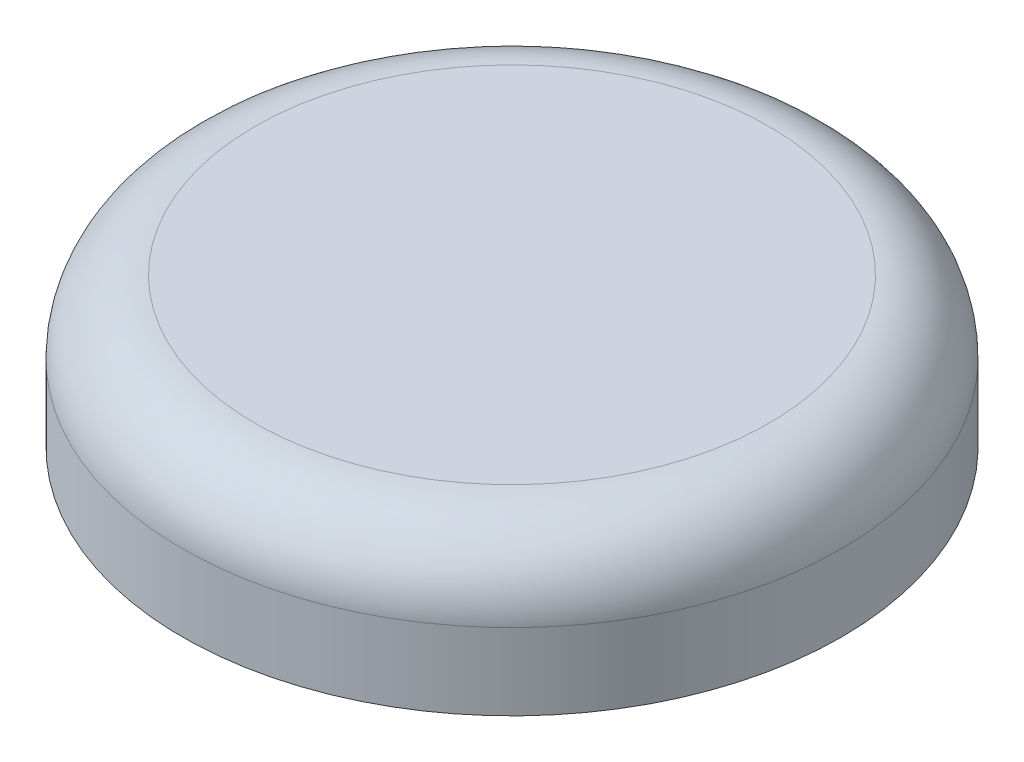
ISO-10303-21;
HEADER;
FILE_DESCRIPTION(('STEP AP214'),'2;1');
FILE_NAME('part.step','',(''),(''),'','','');
FILE_SCHEMA(('AUTOMOTIVE_DESIGN { 1 0 10303 214 1 1 1 1 }'));
ENDSEC;
DATA;
#1=APPLICATION_CONTEXT('core data for automotive mechanical design processes');
#2=APPLICATION_PROTOCOL_DEFINITION('international standard','automotive_design',2000,#1);
#3=PRODUCT_CONTEXT('',#1,'mechanical');
#4=PRODUCT('Part','Part','',(#3));
#5=PRODUCT_RELATED_PRODUCT_CATEGORY('part','',(#4));
#6=PRODUCT_DEFINITION_FORMATION('','',#4);
#7=PRODUCT_DEFINITION_CONTEXT('part definition',#1,'design');
#8=PRODUCT_DEFINITION('design','',#6,#7);
#9=PRODUCT_DEFINITION_SHAPE('','',#8);
#10=(LENGTH_UNIT() NAMED_UNIT(*) SI_UNIT(.MILLI.,.METRE.));
#11=(NAMED_UNIT(*) PLANE_ANGLE_UNIT() SI_UNIT($,.RADIAN.));
#12=(NAMED_UNIT(*) SI_UNIT($,.STERADIAN.) SOLID_ANGLE_UNIT());
#13=UNCERTAINTY_MEASURE_WITH_UNIT(LENGTH_MEASURE(1.E-05),#10,'distance_accuracy_value','');
#14=(GEOMETRIC_REPRESENTATION_CONTEXT(3) GLOBAL_UNCERTAINTY_ASSIGNED_CONTEXT((#13)) GLOBAL_UNIT_ASSIGNED_CONTEXT((#10,
#11,#12)) REPRESENTATION_CONTEXT('',''));
#15=CARTESIAN_POINT('',(0.,0.,0.));
#16=DIRECTION('',(0.,0.,1.));
#17=DIRECTION('',(1.,0.,0.));
#18=AXIS2_PLACEMENT_3D('',#15,#16,#17);
#19=CARTESIAN_POINT('',(-19.5,0.,0.));
#20=DIRECTION('',(0.,-1.,0.));
#21=DIRECTION('',(1.,0.,0.));
#22=AXIS2_PLACEMENT_3D('',#19,#20,#21);
#23=PLANE('',#22);
#24=CARTESIAN_POINT('',(0.,0.,0.));
#25=DIRECTION('',(0.,1.,0.));
#26=DIRECTION('',(-1.,0.,0.));
#27=AXIS2_PLACEMENT_3D('',#24,#25,#26);
#28=CIRCLE('',#27,19.5);
#29=CARTESIAN_POINT('',(-19.5,0.,0.));
#30=VERTEX_POINT('',#29);
#31=EDGE_CURVE('E59',#30,#30,#28,.T.);
#32=ORIENTED_EDGE('',*,*,#31,.F.);
#33=EDGE_LOOP('',(#32));
#34=FACE_BOUND('',#33,.T.);
#35=ADVANCED_FACE('F31',(#34),#23,.T.);
#36=CARTESIAN_POINT('',(0.,2.,0.));
#37=DIRECTION('',(0.,1.,0.));
#38=DIRECTION('',(-1.,0.,0.));
#39=AXIS2_PLACEMENT_3D('',#36,#37,#38);
#40=PLANE('',#39);
#41=CARTESIAN_POINT('',(0.,2.,0.));
#42=DIRECTION('',(0.,1.,0.));
#43=DIRECTION('',(-1.,0.,0.));
#44=AXIS2_PLACEMENT_3D('',#41,#42,#43);
#45=CIRCLE('',#44,19.5);
#46=CARTESIAN_POINT('',(-19.5,2.,0.));
#47=VERTEX_POINT('',#46);
#48=EDGE_CURVE('E10',#47,#47,#45,.T.);
#49=ORIENTED_EDGE('',*,*,#48,.T.);
#50=EDGE_LOOP('',(#49));
#51=FACE_BOUND('',#50,.T.);
#52=ADVANCED_FACE('F67',(#51),#40,.T.);
#53=CARTESIAN_POINT('',(0.,-3.5,0.));
#54=DIRECTION('',(0.,1.,0.));
#55=DIRECTION('',(-1.,0.,0.));
#56=AXIS2_PLACEMENT_3D('',#53,#54,#55);
#57=TOROIDAL_SURFACE('',#56,19.5,5.5);
#58=CARTESIAN_POINT('',(0.,-3.5,0.));
#59=DIRECTION('',(0.,1.,0.));
#60=DIRECTION('',(-1.,0.,0.));
#61=AXIS2_PLACEMENT_3D('',#58,#59,#60);
#62=CIRCLE('',#61,25.);
#63=CARTESIAN_POINT('',(-25.,-3.5,0.));
#64=VERTEX_POINT('',#63);
#65=EDGE_CURVE('E37',#64,#64,#62,.T.);
#66=ORIENTED_EDGE('',*,*,#65,.T.);
#67=EDGE_LOOP('',(#66));
#68=FACE_BOUND('',#67,.T.);
#69=ORIENTED_EDGE('',*,*,#48,.F.);
#70=EDGE_LOOP('',(#69));
#71=FACE_BOUND('',#70,.T.);
#72=ADVANCED_FACE('F71',(#68,#71),#57,.T.);
#73=CARTESIAN_POINT('',(0.,0.,0.));
#74=DIRECTION('',(0.,1.,0.));
#75=DIRECTION('',(-1.,0.,0.));
#76=AXIS2_PLACEMENT_3D('',#73,#74,#75);
#77=CYLINDRICAL_SURFACE('',#76,25.);
#78=CARTESIAN_POINT('',(0.,-9.3,0.));
#79=DIRECTION('',(0.,1.,0.));
#80=DIRECTION('',(-1.,0.,0.));
#81=AXIS2_PLACEMENT_3D('',#78,#79,#80);
#82=CIRCLE('',#81,25.);
#83=CARTESIAN_POINT('',(-25.,-9.3,0.));
#84=VERTEX_POINT('',#83);
#85=EDGE_CURVE('E41',#84,#84,#82,.T.);
#86=ORIENTED_EDGE('',*,*,#85,.T.);
#87=EDGE_LOOP('',(#86));
#88=FACE_BOUND('',#87,.T.);
#89=ORIENTED_EDGE('',*,*,#65,.F.);
#90=EDGE_LOOP('',(#89));
#91=FACE_BOUND('',#90,.T.);
#92=ADVANCED_FACE('F75',(#88,#91),#77,.T.);
#93=CARTESIAN_POINT('',(-25.,-9.3,0.));
#94=DIRECTION('',(0.,-1.,0.));
#95=DIRECTION('',(1.,0.,0.));
#96=AXIS2_PLACEMENT_3D('',#93,#94,#95);
#97=PLANE('',#96);
#98=CARTESIAN_POINT('',(0.,-9.3,0.));
#99=DIRECTION('',(0.,1.,0.));
#100=DIRECTION('',(-1.,0.,0.));
#101=AXIS2_PLACEMENT_3D('',#98,#99,#100);
#102=CIRCLE('',#101,24.);
#103=CARTESIAN_POINT('',(-24.,-9.30000000000001,0.));
#104=VERTEX_POINT('',#103);
#105=EDGE_CURVE('E45',#104,#104,#102,.T.);
#106=ORIENTED_EDGE('',*,*,#105,.T.);
#107=EDGE_LOOP('',(#106));
#108=FACE_BOUND('',#107,.T.);
#109=ORIENTED_EDGE('',*,*,#85,.F.);
#110=EDGE_LOOP('',(#109));
#111=FACE_BOUND('',#110,.T.);
#112=ADVANCED_FACE('F80',(#108,#111),#97,.T.);
#113=CARTESIAN_POINT('',(0.,0.,0.));
#114=DIRECTION('',(0.,1.,0.));
#115=DIRECTION('',(-1.,0.,0.));
#116=AXIS2_PLACEMENT_3D('',#113,#114,#115);
#117=CYLINDRICAL_SURFACE('',#116,24.);
#118=CARTESIAN_POINT('',(0.,-4.3,0.));
#119=DIRECTION('',(0.,1.,0.));
#120=DIRECTION('',(-1.,0.,0.));
#121=AXIS2_PLACEMENT_3D('',#118,#119,#120);
#122=CIRCLE('',#121,24.);
#123=CARTESIAN_POINT('',(-24.,-4.3,0.));
#124=VERTEX_POINT('',#123);
#125=EDGE_CURVE('E50',#124,#124,#122,.T.);
#126=ORIENTED_EDGE('',*,*,#125,.T.);
#127=EDGE_LOOP('',(#126));
#128=FACE_BOUND('',#127,.T.);
#129=ORIENTED_EDGE('',*,*,#105,.F.);
#130=EDGE_LOOP('',(#129));
#131=FACE_BOUND('',#130,.T.);
#132=ADVANCED_FACE('F84',(#128,#131),#117,.F.);
#133=CARTESIAN_POINT('',(-24.,-4.3,0.));
#134=DIRECTION('',(0.,-1.,0.));
#135=DIRECTION('',(1.,0.,0.));
#136=AXIS2_PLACEMENT_3D('',#133,#134,#135);
#137=PLANE('',#136);
#138=CARTESIAN_POINT('',(0.,-4.3,0.));
#139=DIRECTION('',(0.,1.,0.));
#140=DIRECTION('',(-1.,0.,0.));
#141=AXIS2_PLACEMENT_3D('',#138,#139,#140);
#142=CIRCLE('',#141,23.);
#143=CARTESIAN_POINT('',(-23.,-4.3,0.));
#144=VERTEX_POINT('',#143);
#145=EDGE_CURVE('E53',#144,#144,#142,.T.);
#146=ORIENTED_EDGE('',*,*,#145,.T.);
#147=EDGE_LOOP('',(#146));
#148=FACE_BOUND('',#147,.T.);
#149=ORIENTED_EDGE('',*,*,#125,.F.);
#150=EDGE_LOOP('',(#149));
#151=FACE_BOUND('',#150,.T.);
#152=ADVANCED_FACE('F88',(#148,#151),#137,.T.);
#153=CARTESIAN_POINT('',(0.,0.,0.));
#154=DIRECTION('',(0.,1.,0.));
#155=DIRECTION('',(-1.,0.,0.));
#156=AXIS2_PLACEMENT_3D('',#153,#154,#155);
#157=CYLINDRICAL_SURFACE('',#156,23.);
#158=CARTESIAN_POINT('',(0.,-3.5,0.));
#159=DIRECTION('',(0.,1.,0.));
#160=DIRECTION('',(-1.,0.,0.));
#161=AXIS2_PLACEMENT_3D('',#158,#159,#160);
#162=CIRCLE('',#161,23.);
#163=CARTESIAN_POINT('',(-23.,-3.5,0.));
#164=VERTEX_POINT('',#163);
#165=EDGE_CURVE('E56',#164,#164,#162,.T.);
#166=ORIENTED_EDGE('',*,*,#165,.T.);
#167=EDGE_LOOP('',(#166));
#168=FACE_BOUND('',#167,.T.);
#169=ORIENTED_EDGE('',*,*,#145,.F.);
#170=EDGE_LOOP('',(#169));
#171=FACE_BOUND('',#170,.T.);
#172=ADVANCED_FACE('F92',(#168,#171),#157,.F.);
#173=CARTESIAN_POINT('',(0.,-3.5,0.));
#174=DIRECTION('',(0.,1.,0.));
#175=DIRECTION('',(-1.,0.,0.));
#176=AXIS2_PLACEMENT_3D('',#173,#174,#175);
#177=TOROIDAL_SURFACE('',#176,19.5,3.5);
#178=ORIENTED_EDGE('',*,*,#31,.T.);
#179=EDGE_LOOP('',(#178));
#180=FACE_BOUND('',#179,.T.);
#181=ORIENTED_EDGE('',*,*,#165,.F.);
#182=EDGE_LOOP('',(#181));
#183=FACE_BOUND('',#182,.T.);
#184=ADVANCED_FACE('F63',(#180,#183),#177,.F.);
#185=CLOSED_SHELL('',(#35,#52,#72,#92,#112,#132,#152,#172,#184));
#186=MANIFOLD_SOLID_BREP('B2',#185);
#187=ADVANCED_BREP_SHAPE_REPRESENTATION('',(#18,#186),#14);
#188=SHAPE_DEFINITION_REPRESENTATION(#9,#187);
ENDSEC;
END-ISO-10303-21;
